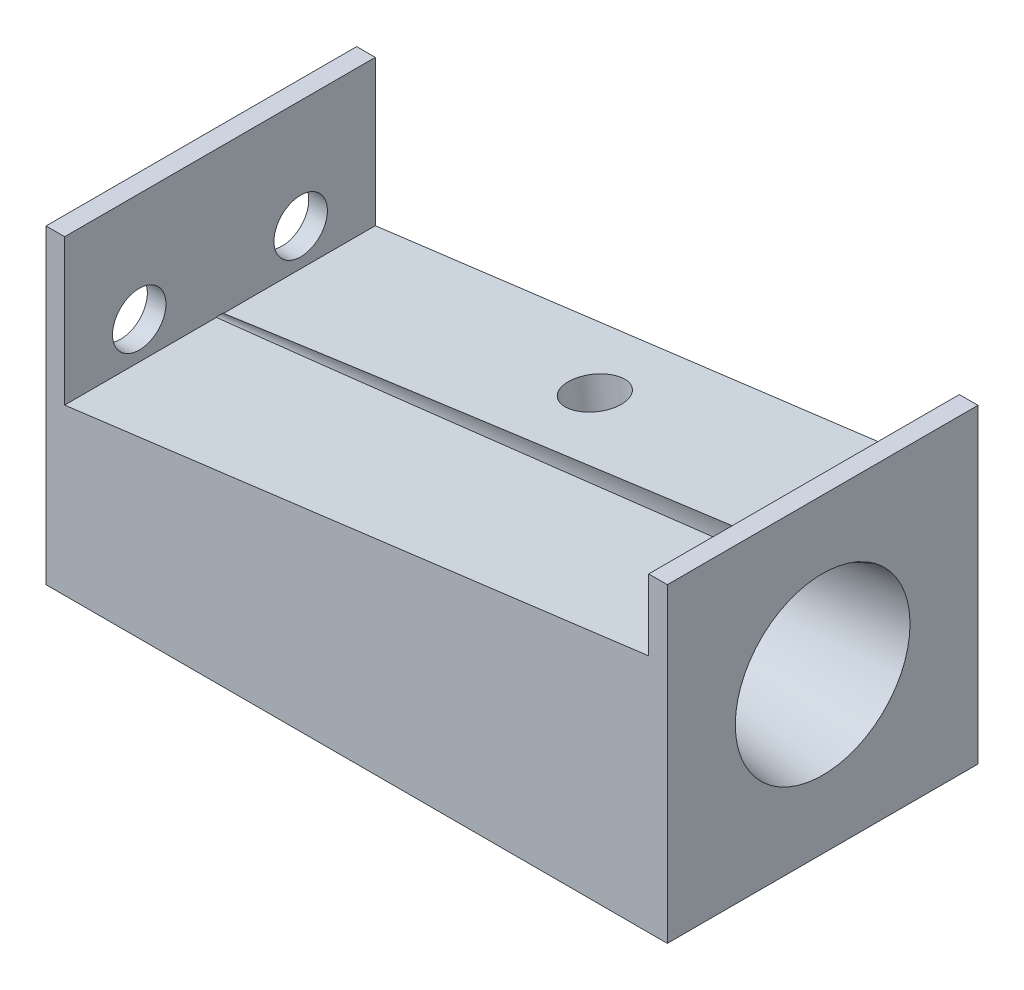
ISO-10303-21;
HEADER;
FILE_DESCRIPTION(('STEP AP214'),'2;1');
FILE_NAME('part.step','',(''),(''),'','','');
FILE_SCHEMA(('AUTOMOTIVE_DESIGN { 1 0 10303 214 1 1 1 1 }'));
ENDSEC;
DATA;
#1=APPLICATION_CONTEXT('core data for automotive mechanical design processes');
#2=APPLICATION_PROTOCOL_DEFINITION('international standard','automotive_design',2000,#1);
#3=PRODUCT_CONTEXT('',#1,'mechanical');
#4=PRODUCT('Part','Part','',(#3));
#5=PRODUCT_RELATED_PRODUCT_CATEGORY('part','',(#4));
#6=PRODUCT_DEFINITION_FORMATION('','',#4);
#7=PRODUCT_DEFINITION_CONTEXT('part definition',#1,'design');
#8=PRODUCT_DEFINITION('design','',#6,#7);
#9=PRODUCT_DEFINITION_SHAPE('','',#8);
#10=(LENGTH_UNIT() NAMED_UNIT(*) SI_UNIT(.MILLI.,.METRE.));
#11=(NAMED_UNIT(*) PLANE_ANGLE_UNIT() SI_UNIT($,.RADIAN.));
#12=(NAMED_UNIT(*) SI_UNIT($,.STERADIAN.) SOLID_ANGLE_UNIT());
#13=UNCERTAINTY_MEASURE_WITH_UNIT(LENGTH_MEASURE(1.E-05),#10,'distance_accuracy_value','');
#14=(GEOMETRIC_REPRESENTATION_CONTEXT(3) GLOBAL_UNCERTAINTY_ASSIGNED_CONTEXT((#13)) GLOBAL_UNIT_ASSIGNED_CONTEXT((#10,
#11,#12)) REPRESENTATION_CONTEXT('',''));
#15=CARTESIAN_POINT('',(0.,0.,0.));
#16=DIRECTION('',(0.,0.,1.));
#17=DIRECTION('',(1.,0.,0.));
#18=AXIS2_PLACEMENT_3D('',#15,#16,#17);
#19=CARTESIAN_POINT('',(0.,12.7,0.));
#20=DIRECTION('',(0.,-1.,0.));
#21=DIRECTION('',(0.,0.,-1.));
#22=AXIS2_PLACEMENT_3D('',#19,#20,#21);
#23=PLANE('',#22);
#24=DIRECTION('',(1.,0.,0.));
#25=VECTOR('',#24,1.);
#26=CARTESIAN_POINT('',(-12.7,12.7,6.35000000000001));
#27=LINE('',#26,#25);
#28=CARTESIAN_POINT('',(-12.7,12.7,6.35000000000001));
#29=VERTEX_POINT('',#28);
#30=CARTESIAN_POINT('',(-11.938,12.7,6.35000000000001));
#31=VERTEX_POINT('',#30);
#32=EDGE_CURVE('E201',#29,#31,#27,.T.);
#33=ORIENTED_EDGE('',*,*,#32,.T.);
#34=DIRECTION('',(0.,0.,1.));
#35=VECTOR('',#34,1.);
#36=CARTESIAN_POINT('',(-11.938,12.7,-30.9587515882657));
#37=LINE('',#36,#35);
#38=CARTESIAN_POINT('',(-11.938,12.7,-6.35000000000001));
#39=VERTEX_POINT('',#38);
#40=EDGE_CURVE('E164',#39,#31,#37,.T.);
#41=ORIENTED_EDGE('',*,*,#40,.F.);
#42=DIRECTION('',(-1.,0.,0.));
#43=VECTOR('',#42,1.);
#44=CARTESIAN_POINT('',(-12.7,12.7,-6.35000000000001));
#45=LINE('',#44,#43);
#46=CARTESIAN_POINT('',(-12.7,12.7,-6.35000000000001));
#47=VERTEX_POINT('',#46);
#48=EDGE_CURVE('E193',#39,#47,#45,.T.);
#49=ORIENTED_EDGE('',*,*,#48,.T.);
#50=DIRECTION('',(0.,0.,1.));
#51=VECTOR('',#50,1.);
#52=CARTESIAN_POINT('',(-12.7,12.7,6.35000000000001));
#53=LINE('',#52,#51);
#54=EDGE_CURVE('E198',#47,#29,#53,.T.);
#55=ORIENTED_EDGE('',*,*,#54,.T.);
#56=EDGE_LOOP('',(#33,#41,#49,#55));
#57=FACE_BOUND('',#56,.T.);
#58=ADVANCED_FACE('F54',(#57),#23,.F.);
#59=CARTESIAN_POINT('',(12.7,12.7,6.35000000000001));
#60=DIRECTION('',(-1.,0.,0.));
#61=DIRECTION('',(0.,0.,1.));
#62=AXIS2_PLACEMENT_3D('',#59,#60,#61);
#63=PLANE('',#62);
#64=CARTESIAN_POINT('',(12.7,6.35000000000001,0.));
#65=DIRECTION('',(1.,0.,0.));
#66=DIRECTION('',(0.,0.,-1.));
#67=AXIS2_PLACEMENT_3D('',#64,#65,#66);
#68=CIRCLE('',#67,3.571875);
#69=CARTESIAN_POINT('',(12.7,6.35000000000001,-3.571875));
#70=VERTEX_POINT('',#69);
#71=EDGE_CURVE('E183',#70,#70,#68,.T.);
#72=ORIENTED_EDGE('',*,*,#71,.F.);
#73=EDGE_LOOP('',(#72));
#74=FACE_BOUND('',#73,.T.);
#75=DIRECTION('',(0.,0.,-1.));
#76=VECTOR('',#75,1.);
#77=CARTESIAN_POINT('',(12.7,0.,6.35000000000001));
#78=LINE('',#77,#76);
#79=CARTESIAN_POINT('',(12.7,0.,6.35000000000001));
#80=VERTEX_POINT('',#79);
#81=CARTESIAN_POINT('',(12.7,0.,-6.35000000000001));
#82=VERTEX_POINT('',#81);
#83=EDGE_CURVE('E189',#80,#82,#78,.T.);
#84=ORIENTED_EDGE('',*,*,#83,.T.);
#85=DIRECTION('',(0.,-1.,0.));
#86=VECTOR('',#85,1.);
#87=CARTESIAN_POINT('',(12.7,12.7,-6.35000000000001));
#88=LINE('',#87,#86);
#89=CARTESIAN_POINT('',(12.7,12.7,-6.35000000000001));
#90=VERTEX_POINT('',#89);
#91=EDGE_CURVE('E220',#90,#82,#88,.T.);
#92=ORIENTED_EDGE('',*,*,#91,.F.);
#93=DIRECTION('',(0.,0.,-1.));
#94=VECTOR('',#93,1.);
#95=CARTESIAN_POINT('',(12.7,12.7,6.35000000000001));
#96=LINE('',#95,#94);
#97=CARTESIAN_POINT('',(12.7,12.7,6.35000000000001));
#98=VERTEX_POINT('',#97);
#99=EDGE_CURVE('E190',#98,#90,#96,.T.);
#100=ORIENTED_EDGE('',*,*,#99,.F.);
#101=DIRECTION('',(0.,-1.,0.));
#102=VECTOR('',#101,1.);
#103=CARTESIAN_POINT('',(12.7,12.7,6.35000000000001));
#104=LINE('',#103,#102);
#105=EDGE_CURVE('E204',#98,#80,#104,.T.);
#106=ORIENTED_EDGE('',*,*,#105,.T.);
#107=EDGE_LOOP('',(#84,#92,#100,#106));
#108=FACE_BOUND('',#107,.T.);
#109=ADVANCED_FACE('F56',(#74,#108),#63,.F.);
#110=CARTESIAN_POINT('',(-12.7,12.7,-6.35000000000001));
#111=DIRECTION('',(0.,0.,1.));
#112=DIRECTION('',(1.,0.,0.));
#113=AXIS2_PLACEMENT_3D('',#110,#111,#112);
#114=PLANE('',#113);
#115=ORIENTED_EDGE('',*,*,#48,.F.);
#116=DIRECTION('',(0.,1.,0.));
#117=VECTOR('',#116,1.);
#118=CARTESIAN_POINT('',(-11.938,12.7,-6.35000000000001));
#119=LINE('',#118,#117);
#120=CARTESIAN_POINT('',(-11.938,6.73952361526658,-6.35000000000001));
#121=VERTEX_POINT('',#120);
#122=EDGE_CURVE('E163',#121,#39,#119,.T.);
#123=ORIENTED_EDGE('',*,*,#122,.F.);
#124=DIRECTION('',(-0.99189168638226,-0.127086122317727,0.));
#125=VECTOR('',#124,1.);
#126=CARTESIAN_POINT('',(11.938,9.79863611526658,-6.35000000000002));
#127=LINE('',#126,#125);
#128=CARTESIAN_POINT('',(11.938,9.79863611526658,-6.35000000000002));
#129=VERTEX_POINT('',#128);
#130=EDGE_CURVE('E166',#129,#121,#127,.T.);
#131=ORIENTED_EDGE('',*,*,#130,.F.);
#132=DIRECTION('',(0.,-1.,0.));
#133=VECTOR('',#132,1.);
#134=CARTESIAN_POINT('',(11.938,12.7,-6.35000000000001));
#135=LINE('',#134,#133);
#136=CARTESIAN_POINT('',(11.938,12.7,-6.35000000000001));
#137=VERTEX_POINT('',#136);
#138=EDGE_CURVE('E161',#137,#129,#135,.T.);
#139=ORIENTED_EDGE('',*,*,#138,.F.);
#140=EDGE_CURVE('E195',#90,#137,#45,.T.);
#141=ORIENTED_EDGE('',*,*,#140,.F.);
#142=ORIENTED_EDGE('',*,*,#91,.T.);
#143=DIRECTION('',(-1.,0.,0.));
#144=VECTOR('',#143,1.);
#145=CARTESIAN_POINT('',(-12.7,0.,-6.35000000000001));
#146=LINE('',#145,#144);
#147=CARTESIAN_POINT('',(-12.7,0.,-6.35000000000001));
#148=VERTEX_POINT('',#147);
#149=EDGE_CURVE('E207',#82,#148,#146,.T.);
#150=ORIENTED_EDGE('',*,*,#149,.T.);
#151=DIRECTION('',(0.,-1.,0.));
#152=VECTOR('',#151,1.);
#153=CARTESIAN_POINT('',(-12.7,12.7,-6.35000000000001));
#154=LINE('',#153,#152);
#155=EDGE_CURVE('E217',#47,#148,#154,.T.);
#156=ORIENTED_EDGE('',*,*,#155,.F.);
#157=EDGE_LOOP('',(#115,#123,#131,#139,#141,#142,#150,#156));
#158=FACE_BOUND('',#157,.T.);
#159=ADVANCED_FACE('F270',(#158),#114,.F.);
#160=CARTESIAN_POINT('',(-12.7,12.7,6.35000000000001));
#161=DIRECTION('',(1.,0.,0.));
#162=DIRECTION('',(0.,0.,-1.));
#163=AXIS2_PLACEMENT_3D('',#160,#161,#162);
#164=PLANE('',#163);
#165=CARTESIAN_POINT('',(-12.7,8.25499999999998,-3.29955678841873));
#166=DIRECTION('',(-1.,0.,0.));
#167=DIRECTION('',(0.,0.,1.));
#168=AXIS2_PLACEMENT_3D('',#165,#166,#167);
#169=CIRCLE('',#168,1.09219999999999);
#170=CARTESIAN_POINT('',(-12.7,8.25499999999998,-2.20735678841874));
#171=VERTEX_POINT('',#170);
#172=EDGE_CURVE('E258',#171,#171,#169,.T.);
#173=ORIENTED_EDGE('',*,*,#172,.F.);
#174=EDGE_LOOP('',(#173));
#175=FACE_BOUND('',#174,.T.);
#176=CARTESIAN_POINT('',(-12.7,8.25500000000002,3.29955678841871));
#177=DIRECTION('',(-1.,0.,0.));
#178=DIRECTION('',(0.,0.,1.));
#179=AXIS2_PLACEMENT_3D('',#176,#177,#178);
#180=CIRCLE('',#179,1.09219999999999);
#181=CARTESIAN_POINT('',(-12.7,8.25500000000002,4.3917567884187));
#182=VERTEX_POINT('',#181);
#183=EDGE_CURVE('E251',#182,#182,#180,.T.);
#184=ORIENTED_EDGE('',*,*,#183,.F.);
#185=EDGE_LOOP('',(#184));
#186=FACE_BOUND('',#185,.T.);
#187=CARTESIAN_POINT('',(-12.7,2.54,0.));
#188=DIRECTION('',(-1.,0.,0.));
#189=DIRECTION('',(0.,0.,1.));
#190=AXIS2_PLACEMENT_3D('',#187,#188,#189);
#191=CIRCLE('',#190,1.09219999999999);
#192=CARTESIAN_POINT('',(-12.7,2.54,1.09219999999999));
#193=VERTEX_POINT('',#192);
#194=EDGE_CURVE('E148',#193,#193,#191,.T.);
#195=ORIENTED_EDGE('',*,*,#194,.F.);
#196=EDGE_LOOP('',(#195));
#197=FACE_BOUND('',#196,.T.);
#198=CARTESIAN_POINT('',(-12.7,6.35,0.));
#199=DIRECTION('',(-1.,0.,0.));
#200=DIRECTION('',(0.,0.,1.));
#201=AXIS2_PLACEMENT_3D('',#198,#199,#200);
#202=CIRCLE('',#201,0.3175);
#203=CARTESIAN_POINT('',(-12.7,6.35,0.3175));
#204=VERTEX_POINT('',#203);
#205=EDGE_CURVE('E186',#204,#204,#202,.T.);
#206=ORIENTED_EDGE('',*,*,#205,.F.);
#207=EDGE_LOOP('',(#206));
#208=FACE_BOUND('',#207,.T.);
#209=DIRECTION('',(0.,0.,1.));
#210=VECTOR('',#209,1.);
#211=CARTESIAN_POINT('',(-12.7,0.,6.35000000000001));
#212=LINE('',#211,#210);
#213=CARTESIAN_POINT('',(-12.7,0.,6.35000000000001));
#214=VERTEX_POINT('',#213);
#215=EDGE_CURVE('E209',#148,#214,#212,.T.);
#216=ORIENTED_EDGE('',*,*,#215,.T.);
#217=DIRECTION('',(0.,-1.,0.));
#218=VECTOR('',#217,1.);
#219=CARTESIAN_POINT('',(-12.7,12.7,6.35000000000001));
#220=LINE('',#219,#218);
#221=EDGE_CURVE('E214',#29,#214,#220,.T.);
#222=ORIENTED_EDGE('',*,*,#221,.F.);
#223=ORIENTED_EDGE('',*,*,#54,.F.);
#224=ORIENTED_EDGE('',*,*,#155,.T.);
#225=EDGE_LOOP('',(#216,#222,#223,#224));
#226=FACE_BOUND('',#225,.T.);
#227=ADVANCED_FACE('F266',(#175,#186,#197,#208,#226),#164,.F.);
#228=CARTESIAN_POINT('',(-12.7,12.7,6.35000000000001));
#229=DIRECTION('',(0.,0.,-1.));
#230=DIRECTION('',(-1.,0.,0.));
#231=AXIS2_PLACEMENT_3D('',#228,#229,#230);
#232=PLANE('',#231);
#233=DIRECTION('',(0.99189168638226,0.127086122317727,0.));
#234=VECTOR('',#233,1.);
#235=CARTESIAN_POINT('',(11.938,9.79863611526658,6.35000000000001));
#236=LINE('',#235,#234);
#237=CARTESIAN_POINT('',(-11.938,6.73952361526658,6.35000000000001));
#238=VERTEX_POINT('',#237);
#239=CARTESIAN_POINT('',(11.938,9.79863611526658,6.35000000000001));
#240=VERTEX_POINT('',#239);
#241=EDGE_CURVE('E169',#238,#240,#236,.T.);
#242=ORIENTED_EDGE('',*,*,#241,.F.);
#243=DIRECTION('',(0.,-1.,0.));
#244=VECTOR('',#243,1.);
#245=CARTESIAN_POINT('',(-11.938,12.7,6.35000000000001));
#246=LINE('',#245,#244);
#247=EDGE_CURVE('E160',#31,#238,#246,.T.);
#248=ORIENTED_EDGE('',*,*,#247,.F.);
#249=ORIENTED_EDGE('',*,*,#32,.F.);
#250=ORIENTED_EDGE('',*,*,#221,.T.);
#251=DIRECTION('',(1.,0.,0.));
#252=VECTOR('',#251,1.);
#253=CARTESIAN_POINT('',(-12.7,0.,6.35000000000001));
#254=LINE('',#253,#252);
#255=EDGE_CURVE('E194',#214,#80,#254,.T.);
#256=ORIENTED_EDGE('',*,*,#255,.T.);
#257=ORIENTED_EDGE('',*,*,#105,.F.);
#258=CARTESIAN_POINT('',(11.938,12.7,6.35000000000001));
#259=VERTEX_POINT('',#258);
#260=EDGE_CURVE('E200',#259,#98,#27,.T.);
#261=ORIENTED_EDGE('',*,*,#260,.F.);
#262=DIRECTION('',(0.,1.,0.));
#263=VECTOR('',#262,1.);
#264=CARTESIAN_POINT('',(11.938,12.7,6.35000000000001));
#265=LINE('',#264,#263);
#266=EDGE_CURVE('E71',#240,#259,#265,.T.);
#267=ORIENTED_EDGE('',*,*,#266,.F.);
#268=EDGE_LOOP('',(#242,#248,#249,#250,#256,#257,#261,#267));
#269=FACE_BOUND('',#268,.T.);
#270=ADVANCED_FACE('F269',(#269),#232,.F.);
#271=ORIENTED_EDGE('',*,*,#140,.T.);
#272=DIRECTION('',(0.,0.,1.));
#273=VECTOR('',#272,1.);
#274=CARTESIAN_POINT('',(11.938,12.7,-30.9587515882656));
#275=LINE('',#274,#273);
#276=EDGE_CURVE('E174',#137,#259,#275,.T.);
#277=ORIENTED_EDGE('',*,*,#276,.T.);
#278=ORIENTED_EDGE('',*,*,#260,.T.);
#279=ORIENTED_EDGE('',*,*,#99,.T.);
#280=EDGE_LOOP('',(#271,#277,#278,#279));
#281=FACE_BOUND('',#280,.T.);
#282=ADVANCED_FACE('F295',(#281),#23,.F.);
#283=CARTESIAN_POINT('',(0.,0.,0.));
#284=DIRECTION('',(0.,-1.,0.));
#285=DIRECTION('',(0.,0.,-1.));
#286=AXIS2_PLACEMENT_3D('',#283,#284,#285);
#287=PLANE('',#286);
#288=ORIENTED_EDGE('',*,*,#83,.F.);
#289=ORIENTED_EDGE('',*,*,#255,.F.);
#290=ORIENTED_EDGE('',*,*,#215,.F.);
#291=ORIENTED_EDGE('',*,*,#149,.F.);
#292=EDGE_LOOP('',(#288,#289,#290,#291));
#293=FACE_BOUND('',#292,.T.);
#294=ADVANCED_FACE('F289',(#293),#287,.T.);
#295=CARTESIAN_POINT('',(-12.7,6.35,0.));
#296=DIRECTION('',(1.,0.,0.));
#297=DIRECTION('',(0.,0.,-1.));
#298=AXIS2_PLACEMENT_3D('',#295,#296,#297);
#299=CONICAL_SURFACE('',#298,0.3175,0.127430724947763);
#300=CARTESIAN_POINT('',(11.938,6.35,0.));
#301=DIRECTION('',(1.,0.,0.));
#302=DIRECTION('',(0.,0.,-1.));
#303=AXIS2_PLACEMENT_3D('',#300,#301,#302);
#304=CIRCLE('',#303,3.47424375);
#305=CARTESIAN_POINT('',(11.938,9.79863611526658,0.421044628149008));
#306=VERTEX_POINT('',#305);
#307=CARTESIAN_POINT('',(11.938,9.79863611526658,-0.421044628149004));
#308=VERTEX_POINT('',#307);
#309=EDGE_CURVE('E231',#306,#308,#304,.F.);
#310=ORIENTED_EDGE('',*,*,#309,.T.);
#311=CARTESIAN_POINT('',(11.9382,9.79866174026658,-0.421046186640392));
#312=CARTESIAN_POINT('',(10.9190526038877,9.66808348013969,-0.413099077385778));
#313=CARTESIAN_POINT('',(9.89990679560557,9.53750542345354,-0.404937813869695));
#314=CARTESIAN_POINT('',(7.86162216284494,9.27635020488109,-0.388074500535642));
#315=CARTESIAN_POINT('',(6.84248333835531,9.14577304299336,-0.379372452082512));
#316=CARTESIAN_POINT('',(4.34315752480798,8.82554692313261,-0.357230497608029));
#317=CARTESIAN_POINT('',(2.86297366878489,8.63589836657965,-0.343428185985713));
#318=CARTESIAN_POINT('',(-0.0973730399697471,8.25660394452046,-0.313887016197317));
#319=CARTESIAN_POINT('',(-1.5775358927329,8.06695807901018,-0.298148161346522));
#320=CARTESIAN_POINT('',(-3.79776144504717,7.78249168011991,-0.272203100940242));
#321=CARTESIAN_POINT('',(-4.53783747815261,7.68766943837828,-0.263165229697474));
#322=CARTESIAN_POINT('',(-6.0179749057891,7.49802683046236,-0.24401739250843));
#323=CARTESIAN_POINT('',(-6.75803630034028,7.40320646428549,-0.233907428157008));
#324=CARTESIAN_POINT('',(-8.2381431846513,7.21356776973314,-0.212141024786426));
#325=CARTESIAN_POINT('',(-8.97818867424123,7.11874944137943,-0.200484573658836));
#326=CARTESIAN_POINT('',(-10.0882260932973,6.97652589706286,-0.181068503885646));
#327=CARTESIAN_POINT('',(-10.458234360702,6.92911858780164,-0.174274562270844));
#328=CARTESIAN_POINT('',(-11.1982329078613,6.83430627394686,-0.15971673329694));
#329=CARTESIAN_POINT('',(-11.5682231875686,6.78690126935935,-0.151952843511433));
#330=CARTESIAN_POINT('',(-11.9381999999999,6.73949799026659,-0.143540919200673));
#331=B_SPLINE_CURVE_WITH_KNOTS('',3,(#311,#312,#313,#314,#315,#316,#317,#318,#319,#320,#321,
#322,#323,#324,#325,#326,#327,#328,#329,#330),.UNSPECIFIED.,.F.,.F.,(4,2,2,2,2,2,2,2,2,4),(0.,
3.08252780019916,6.16504782099861,10.6420898749192,15.1191242644296,17.3576654769336,
19.5962033594133,21.8347587698641,22.9540421035381,24.073328237248),.UNSPECIFIED.);
#332=CARTESIAN_POINT('',(-11.938,6.73952361526658,-0.143545490616109));
#333=VERTEX_POINT('',#332);
#334=EDGE_CURVE('E14',#308,#333,#331,.T.);
#335=ORIENTED_EDGE('',*,*,#334,.T.);
#336=CARTESIAN_POINT('',(-11.938,6.35000000000001,0.));
#337=DIRECTION('',(-1.,0.,0.));
#338=DIRECTION('',(0.,0.,1.));
#339=AXIS2_PLACEMENT_3D('',#336,#337,#338);
#340=CIRCLE('',#339,0.41513125);
#341=CARTESIAN_POINT('',(-11.938,6.73952361526658,0.143545490616112));
#342=VERTEX_POINT('',#341);
#343=EDGE_CURVE('E63',#333,#342,#340,.F.);
#344=ORIENTED_EDGE('',*,*,#343,.T.);
#345=CARTESIAN_POINT('',(-11.9381999999999,6.73949799026659,0.143540919200558));
#346=CARTESIAN_POINT('',(-11.694719329828,6.77069395113237,0.149084261420355));
#347=CARTESIAN_POINT('',(-11.4512325905938,6.80189068959675,0.154343019463767));
#348=CARTESIAN_POINT('',(-10.7207564629214,6.89548294345478,0.169409293760371));
#349=CARTESIAN_POINT('',(-10.2337526030568,6.95788031299994,0.17850677491365));
#350=CARTESIAN_POINT('',(-9.25972509157796,7.08267758790816,0.19557486333254));
#351=CARTESIAN_POINT('',(-8.77270143992055,7.14507749327676,0.203545467992256));
#352=CARTESIAN_POINT('',(-7.31161183774628,7.33227959855533,0.226269585365116));
#353=CARTESIAN_POINT('',(-6.33752775643111,7.45708412147384,0.239835391760816));
#354=CARTESIAN_POINT('',(-4.38933590100817,7.70669620294991,0.265129310230499));
#355=CARTESIAN_POINT('',(-3.41522812687223,7.83150376151108,0.276857420001352));
#356=CARTESIAN_POINT('',(-0.492880318682887,8.20592957443533,0.310178234810221));
#357=CARTESIAN_POINT('',(1.45538055321515,8.45555049864728,0.329907374444006));
#358=CARTESIAN_POINT('',(4.826071717904,8.88742030412303,0.361638092391072));
#359=CARTESIAN_POINT('',(6.24849633198307,9.06966845780191,0.37428812638791));
#360=CARTESIAN_POINT('',(9.09334625372145,9.43416485402464,0.398442601534793));
#361=CARTESIAN_POINT('',(10.5157715613205,9.61641309656077,0.409947049868055));
#362=CARTESIAN_POINT('',(11.9382,9.79866174026658,0.421046186640389));
#363=B_SPLINE_CURVE_WITH_KNOTS('',3,(#345,#346,#347,#348,#349,#350,#351,#352,#353,#354,#355,
#356,#357,#358,#359,#360,#361,#362),.UNSPECIFIED.,.F.,.F.,(4,2,2,2,2,2,2,2,4),(0.,
0.736600172181578,2.20980486870877,3.68301297195615,6.6294307405897,9.57585220184993,
15.4687061586622,19.7710304099212,24.0733276824227),.UNSPECIFIED.);
#364=EDGE_CURVE('E223',#342,#306,#363,.T.);
#365=ORIENTED_EDGE('',*,*,#364,.T.);
#366=EDGE_LOOP('',(#310,#335,#344,#365));
#367=FACE_BOUND('',#366,.T.);
#368=ORIENTED_EDGE('',*,*,#71,.T.);
#369=EDGE_LOOP('',(#368));
#370=FACE_BOUND('',#369,.T.);
#371=ORIENTED_EDGE('',*,*,#205,.T.);
#372=EDGE_LOOP('',(#371));
#373=FACE_BOUND('',#372,.T.);
#374=ADVANCED_FACE('F233',(#367,#370,#373),#299,.F.);
#375=CARTESIAN_POINT('',(-11.938,12.7,-30.9587515882657));
#376=DIRECTION('',(-1.,0.,0.));
#377=DIRECTION('',(0.,0.,1.));
#378=AXIS2_PLACEMENT_3D('',#375,#376,#377);
#379=PLANE('',#378);
#380=CARTESIAN_POINT('',(-11.938,8.25499999999998,-3.29955678841873));
#381=DIRECTION('',(-1.,0.,0.));
#382=DIRECTION('',(0.,0.,1.));
#383=AXIS2_PLACEMENT_3D('',#380,#381,#382);
#384=CIRCLE('',#383,1.09219999999999);
#385=CARTESIAN_POINT('',(-11.938,8.25499999999998,-2.20735678841874));
#386=VERTEX_POINT('',#385);
#387=EDGE_CURVE('E58',#386,#386,#384,.T.);
#388=ORIENTED_EDGE('',*,*,#387,.T.);
#389=EDGE_LOOP('',(#388));
#390=FACE_BOUND('',#389,.T.);
#391=CARTESIAN_POINT('',(-11.938,8.25500000000002,3.29955678841871));
#392=DIRECTION('',(-1.,0.,0.));
#393=DIRECTION('',(0.,0.,1.));
#394=AXIS2_PLACEMENT_3D('',#391,#392,#393);
#395=CIRCLE('',#394,1.09219999999999);
#396=CARTESIAN_POINT('',(-11.938,8.25500000000002,4.3917567884187));
#397=VERTEX_POINT('',#396);
#398=EDGE_CURVE('E154',#397,#397,#395,.T.);
#399=ORIENTED_EDGE('',*,*,#398,.T.);
#400=EDGE_LOOP('',(#399));
#401=FACE_BOUND('',#400,.T.);
#402=DIRECTION('',(0.,0.,1.));
#403=VECTOR('',#402,1.);
#404=CARTESIAN_POINT('',(-11.938,6.73952361526658,-30.9587515882657));
#405=LINE('',#404,#403);
#406=EDGE_CURVE('E179',#121,#333,#405,.T.);
#407=ORIENTED_EDGE('',*,*,#406,.F.);
#408=ORIENTED_EDGE('',*,*,#122,.T.);
#409=ORIENTED_EDGE('',*,*,#40,.T.);
#410=ORIENTED_EDGE('',*,*,#247,.T.);
#411=EDGE_CURVE('E172',#342,#238,#405,.T.);
#412=ORIENTED_EDGE('',*,*,#411,.F.);
#413=ORIENTED_EDGE('',*,*,#343,.F.);
#414=EDGE_LOOP('',(#407,#408,#409,#410,#412,#413));
#415=FACE_BOUND('',#414,.T.);
#416=ADVANCED_FACE('F245',(#390,#401,#415),#379,.F.);
#417=CARTESIAN_POINT('',(11.938,12.7,-30.9587515882656));
#418=DIRECTION('',(1.,0.,0.));
#419=DIRECTION('',(0.,0.,-1.));
#420=AXIS2_PLACEMENT_3D('',#417,#418,#419);
#421=PLANE('',#420);
#422=DIRECTION('',(0.,0.,1.));
#423=VECTOR('',#422,1.);
#424=CARTESIAN_POINT('',(11.938,9.79863611526658,-30.9587515882657));
#425=LINE('',#424,#423);
#426=EDGE_CURVE('E78',#306,#240,#425,.T.);
#427=ORIENTED_EDGE('',*,*,#426,.T.);
#428=ORIENTED_EDGE('',*,*,#266,.T.);
#429=ORIENTED_EDGE('',*,*,#276,.F.);
#430=ORIENTED_EDGE('',*,*,#138,.T.);
#431=EDGE_CURVE('E176',#129,#308,#425,.T.);
#432=ORIENTED_EDGE('',*,*,#431,.T.);
#433=ORIENTED_EDGE('',*,*,#309,.F.);
#434=EDGE_LOOP('',(#427,#428,#429,#430,#432,#433));
#435=FACE_BOUND('',#434,.T.);
#436=ADVANCED_FACE('F242',(#435),#421,.F.);
#437=CARTESIAN_POINT('',(11.938,9.79863611526658,-30.9587515882657));
#438=DIRECTION('',(0.127086122317727,-0.991891686382261,0.));
#439=DIRECTION('',(0.99189168638226,0.127086122317727,0.));
#440=AXIS2_PLACEMENT_3D('',#437,#438,#439);
#441=PLANE('',#440);
#442=CARTESIAN_POINT('',(0.,8.26907986526658,-3.38552231407451));
#443=DIRECTION('',(-0.127086122317727,0.991891686382261,0.));
#444=DIRECTION('',(-0.99189168638226,-0.127086122317727,0.));
#445=AXIS2_PLACEMENT_3D('',#442,#443,#444);
#446=CIRCLE('',#445,1.0922);
#447=CARTESIAN_POINT('',(-1.0833440998667,8.13027640247116,-3.38552231407451));
#448=VERTEX_POINT('',#447);
#449=EDGE_CURVE('E147',#448,#448,#446,.T.);
#450=ORIENTED_EDGE('',*,*,#449,.F.);
#451=EDGE_LOOP('',(#450));
#452=FACE_BOUND('',#451,.T.);
#453=ORIENTED_EDGE('',*,*,#431,.F.);
#454=ORIENTED_EDGE('',*,*,#130,.T.);
#455=ORIENTED_EDGE('',*,*,#406,.T.);
#456=ORIENTED_EDGE('',*,*,#334,.F.);
#457=EDGE_LOOP('',(#453,#454,#455,#456));
#458=FACE_BOUND('',#457,.T.);
#459=ADVANCED_FACE('F237',(#452,#458),#441,.F.);
#460=ORIENTED_EDGE('',*,*,#411,.T.);
#461=ORIENTED_EDGE('',*,*,#241,.T.);
#462=ORIENTED_EDGE('',*,*,#426,.F.);
#463=ORIENTED_EDGE('',*,*,#364,.F.);
#464=EDGE_LOOP('',(#460,#461,#462,#463));
#465=FACE_BOUND('',#464,.T.);
#466=ADVANCED_FACE('F241',(#465),#441,.F.);
#467=CARTESIAN_POINT('',(0.41963837589315,4.99385351683236,-3.38552231407451));
#468=DIRECTION('',(-0.127086122317727,0.991891686382261,0.));
#469=DIRECTION('',(-0.99189168638226,-0.127086122317727,0.));
#470=AXIS2_PLACEMENT_3D('',#467,#468,#469);
#471=CONICAL_SURFACE('',#470,1.0922,1.02974425867665);
#472=CARTESIAN_POINT('',(0.50303991047157,4.34291471036659,-3.38552231407451));
#473=VERTEX_POINT('',#472);
#474=VERTEX_LOOP('',#473);
#475=FACE_BOUND('',#474,.T.);
#476=CARTESIAN_POINT('',(0.41963837589315,4.99385351683236,-3.38552231407451));
#477=DIRECTION('',(-0.127086122317727,0.991891686382261,0.));
#478=DIRECTION('',(-0.99189168638226,-0.127086122317727,0.));
#479=AXIS2_PLACEMENT_3D('',#476,#477,#478);
#480=CIRCLE('',#479,1.0922);
#481=CARTESIAN_POINT('',(-0.663705723973553,4.85505005403693,-3.38552231407451));
#482=VERTEX_POINT('',#481);
#483=EDGE_CURVE('E151',#482,#482,#480,.T.);
#484=ORIENTED_EDGE('',*,*,#483,.T.);
#485=EDGE_LOOP('',(#484));
#486=FACE_BOUND('',#485,.T.);
#487=ADVANCED_FACE('F372',(#475,#486),#471,.F.);
#488=CARTESIAN_POINT('',(0.,8.26907986526658,-3.38552231407451));
#489=DIRECTION('',(-0.127086122317727,0.991891686382261,0.));
#490=DIRECTION('',(-0.99189168638226,-0.127086122317727,0.));
#491=AXIS2_PLACEMENT_3D('',#488,#489,#490);
#492=CYLINDRICAL_SURFACE('',#491,1.0922);
#493=ORIENTED_EDGE('',*,*,#483,.F.);
#494=EDGE_LOOP('',(#493));
#495=FACE_BOUND('',#494,.T.);
#496=ORIENTED_EDGE('',*,*,#449,.T.);
#497=EDGE_LOOP('',(#496));
#498=FACE_BOUND('',#497,.T.);
#499=ADVANCED_FACE('F141',(#495,#498),#492,.F.);
#500=CARTESIAN_POINT('',(-9.39800000000002,2.54,0.));
#501=DIRECTION('',(-1.,0.,0.));
#502=DIRECTION('',(0.,0.,1.));
#503=AXIS2_PLACEMENT_3D('',#500,#501,#502);
#504=CONICAL_SURFACE('',#503,1.0922,1.02974425867665);
#505=CARTESIAN_POINT('',(-8.74174003189809,2.54,0.));
#506=VERTEX_POINT('',#505);
#507=VERTEX_LOOP('',#506);
#508=FACE_BOUND('',#507,.T.);
#509=CARTESIAN_POINT('',(-9.39800000000002,2.54,0.));
#510=DIRECTION('',(-1.,0.,0.));
#511=DIRECTION('',(0.,0.,1.));
#512=AXIS2_PLACEMENT_3D('',#509,#510,#511);
#513=CIRCLE('',#512,1.0922);
#514=CARTESIAN_POINT('',(-9.39800000000002,2.54,1.0922));
#515=VERTEX_POINT('',#514);
#516=EDGE_CURVE('E145',#515,#515,#513,.T.);
#517=ORIENTED_EDGE('',*,*,#516,.T.);
#518=EDGE_LOOP('',(#517));
#519=FACE_BOUND('',#518,.T.);
#520=ADVANCED_FACE('F137',(#508,#519),#504,.F.);
#521=CARTESIAN_POINT('',(-12.7,2.54,0.));
#522=DIRECTION('',(-1.,0.,0.));
#523=DIRECTION('',(0.,0.,1.));
#524=AXIS2_PLACEMENT_3D('',#521,#522,#523);
#525=CYLINDRICAL_SURFACE('',#524,1.09219999999999);
#526=ORIENTED_EDGE('',*,*,#516,.F.);
#527=EDGE_LOOP('',(#526));
#528=FACE_BOUND('',#527,.T.);
#529=ORIENTED_EDGE('',*,*,#194,.T.);
#530=EDGE_LOOP('',(#529));
#531=FACE_BOUND('',#530,.T.);
#532=ADVANCED_FACE('F140',(#528,#531),#525,.F.);
#533=CARTESIAN_POINT('',(-12.7,8.25500000000002,3.29955678841871));
#534=DIRECTION('',(-1.,0.,0.));
#535=DIRECTION('',(0.,0.,1.));
#536=AXIS2_PLACEMENT_3D('',#533,#534,#535);
#537=CYLINDRICAL_SURFACE('',#536,1.09219999999999);
#538=ORIENTED_EDGE('',*,*,#183,.T.);
#539=EDGE_LOOP('',(#538));
#540=FACE_BOUND('',#539,.T.);
#541=ORIENTED_EDGE('',*,*,#398,.F.);
#542=EDGE_LOOP('',(#541));
#543=FACE_BOUND('',#542,.T.);
#544=ADVANCED_FACE('F399',(#540,#543),#537,.F.);
#545=CARTESIAN_POINT('',(-12.7,8.25499999999998,-3.29955678841873));
#546=DIRECTION('',(-1.,0.,0.));
#547=DIRECTION('',(0.,0.,1.));
#548=AXIS2_PLACEMENT_3D('',#545,#546,#547);
#549=CYLINDRICAL_SURFACE('',#548,1.09219999999999);
#550=ORIENTED_EDGE('',*,*,#172,.T.);
#551=EDGE_LOOP('',(#550));
#552=FACE_BOUND('',#551,.T.);
#553=ORIENTED_EDGE('',*,*,#387,.F.);
#554=EDGE_LOOP('',(#553));
#555=FACE_BOUND('',#554,.T.);
#556=ADVANCED_FACE('F263',(#552,#555),#549,.F.);
#557=CLOSED_SHELL('',(#58,#109,#159,#227,#270,#282,#294,#374,#416,#436,#459,#466,#487,#499,#520,
#532,#544,#556));
#558=MANIFOLD_SOLID_BREP('B2',#557);
#559=ADVANCED_BREP_SHAPE_REPRESENTATION('',(#18,#558),#14);
#560=SHAPE_DEFINITION_REPRESENTATION(#9,#559);
ENDSEC;
END-ISO-10303-21;
